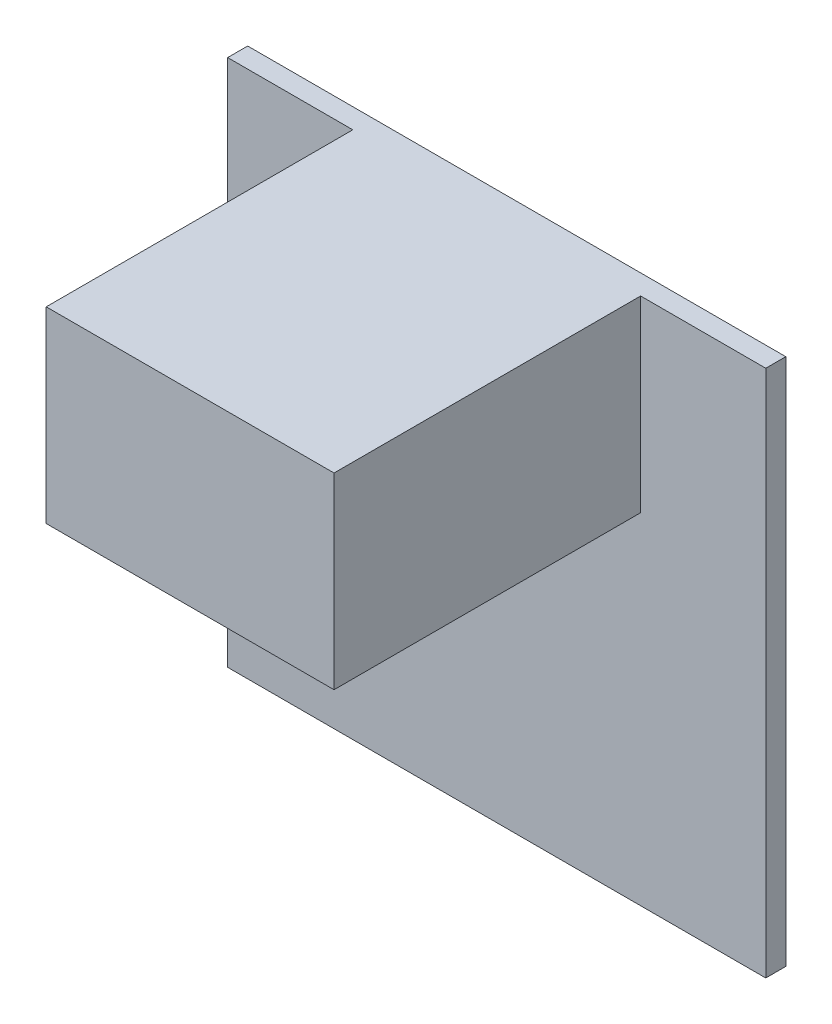
ISO-10303-21;
HEADER;
FILE_DESCRIPTION(('STEP AP214'),'2;1');
FILE_NAME('part.step','',(''),(''),'','','');
FILE_SCHEMA(('AUTOMOTIVE_DESIGN { 1 0 10303 214 1 1 1 1 }'));
ENDSEC;
DATA;
#1=APPLICATION_CONTEXT('core data for automotive mechanical design processes');
#2=APPLICATION_PROTOCOL_DEFINITION('international standard','automotive_design',2000,#1);
#3=PRODUCT_CONTEXT('',#1,'mechanical');
#4=PRODUCT('Part','Part','',(#3));
#5=PRODUCT_RELATED_PRODUCT_CATEGORY('part','',(#4));
#6=PRODUCT_DEFINITION_FORMATION('','',#4);
#7=PRODUCT_DEFINITION_CONTEXT('part definition',#1,'design');
#8=PRODUCT_DEFINITION('design','',#6,#7);
#9=PRODUCT_DEFINITION_SHAPE('','',#8);
#10=(LENGTH_UNIT() NAMED_UNIT(*) SI_UNIT(.MILLI.,.METRE.));
#11=(NAMED_UNIT(*) PLANE_ANGLE_UNIT() SI_UNIT($,.RADIAN.));
#12=(NAMED_UNIT(*) SI_UNIT($,.STERADIAN.) SOLID_ANGLE_UNIT());
#13=UNCERTAINTY_MEASURE_WITH_UNIT(LENGTH_MEASURE(1.E-05),#10,'distance_accuracy_value','');
#14=(GEOMETRIC_REPRESENTATION_CONTEXT(3) GLOBAL_UNCERTAINTY_ASSIGNED_CONTEXT((#13)) GLOBAL_UNIT_ASSIGNED_CONTEXT((#10,
#11,#12)) REPRESENTATION_CONTEXT('',''));
#15=CARTESIAN_POINT('',(0.,0.,0.));
#16=DIRECTION('',(0.,0.,1.));
#17=DIRECTION('',(1.,0.,0.));
#18=AXIS2_PLACEMENT_3D('',#15,#16,#17);
#19=CARTESIAN_POINT('',(0.,0.,1.6));
#20=DIRECTION('',(0.,0.,-1.));
#21=DIRECTION('',(-1.,0.,0.));
#22=AXIS2_PLACEMENT_3D('',#19,#20,#21);
#23=PLANE('',#22);
#24=DIRECTION('',(0.,-1.,0.));
#25=VECTOR('',#24,1.);
#26=CARTESIAN_POINT('',(10.,42.2,1.6));
#27=LINE('',#26,#25);
#28=CARTESIAN_POINT('',(10.,42.2,1.6));
#29=VERTEX_POINT('',#28);
#30=CARTESIAN_POINT('',(10.,27.2,1.6));
#31=VERTEX_POINT('',#30);
#32=EDGE_CURVE('E123',#29,#31,#27,.T.);
#33=ORIENTED_EDGE('',*,*,#32,.F.);
#34=DIRECTION('',(-1.,0.,0.));
#35=VECTOR('',#34,1.);
#36=CARTESIAN_POINT('',(0.,42.2,1.6));
#37=LINE('',#36,#35);
#38=CARTESIAN_POINT('',(0.,42.2,1.6));
#39=VERTEX_POINT('',#38);
#40=EDGE_CURVE('E61',#29,#39,#37,.T.);
#41=ORIENTED_EDGE('',*,*,#40,.T.);
#42=DIRECTION('',(0.,-1.,0.));
#43=VECTOR('',#42,1.);
#44=CARTESIAN_POINT('',(0.,0.,1.6));
#45=LINE('',#44,#43);
#46=CARTESIAN_POINT('',(0.,0.,1.6));
#47=VERTEX_POINT('',#46);
#48=EDGE_CURVE('E148',#39,#47,#45,.T.);
#49=ORIENTED_EDGE('',*,*,#48,.T.);
#50=DIRECTION('',(1.,0.,0.));
#51=VECTOR('',#50,1.);
#52=CARTESIAN_POINT('',(0.,0.,1.6));
#53=LINE('',#52,#51);
#54=CARTESIAN_POINT('',(43.,0.,1.6));
#55=VERTEX_POINT('',#54);
#56=EDGE_CURVE('E90',#47,#55,#53,.T.);
#57=ORIENTED_EDGE('',*,*,#56,.T.);
#58=DIRECTION('',(0.,1.,0.));
#59=VECTOR('',#58,1.);
#60=CARTESIAN_POINT('',(43.,0.,1.6));
#61=LINE('',#60,#59);
#62=CARTESIAN_POINT('',(43.,42.2,1.6));
#63=VERTEX_POINT('',#62);
#64=EDGE_CURVE('E151',#55,#63,#61,.T.);
#65=ORIENTED_EDGE('',*,*,#64,.T.);
#66=CARTESIAN_POINT('',(33.,42.2,1.6));
#67=VERTEX_POINT('',#66);
#68=EDGE_CURVE('E153',#63,#67,#37,.T.);
#69=ORIENTED_EDGE('',*,*,#68,.T.);
#70=DIRECTION('',(0.,-1.,0.));
#71=VECTOR('',#70,1.);
#72=CARTESIAN_POINT('',(33.,42.2,1.6));
#73=LINE('',#72,#71);
#74=CARTESIAN_POINT('',(33.,27.2,1.6));
#75=VERTEX_POINT('',#74);
#76=EDGE_CURVE('E141',#67,#75,#73,.T.);
#77=ORIENTED_EDGE('',*,*,#76,.T.);
#78=DIRECTION('',(1.,0.,0.));
#79=VECTOR('',#78,1.);
#80=CARTESIAN_POINT('',(10.,27.2,1.6));
#81=LINE('',#80,#79);
#82=EDGE_CURVE('E52',#31,#75,#81,.T.);
#83=ORIENTED_EDGE('',*,*,#82,.F.);
#84=EDGE_LOOP('',(#33,#41,#49,#57,#65,#69,#77,#83));
#85=FACE_BOUND('',#84,.T.);
#86=ADVANCED_FACE('F37',(#85),#23,.F.);
#87=CARTESIAN_POINT('',(0.,0.,1.6));
#88=DIRECTION('',(1.,0.,0.));
#89=DIRECTION('',(0.,0.,-1.));
#90=AXIS2_PLACEMENT_3D('',#87,#88,#89);
#91=PLANE('',#90);
#92=DIRECTION('',(0.,-1.,0.));
#93=VECTOR('',#92,1.);
#94=CARTESIAN_POINT('',(0.,0.,0.));
#95=LINE('',#94,#93);
#96=CARTESIAN_POINT('',(0.,42.2,0.));
#97=VERTEX_POINT('',#96);
#98=CARTESIAN_POINT('',(0.,0.,0.));
#99=VERTEX_POINT('',#98);
#100=EDGE_CURVE('E130',#97,#99,#95,.T.);
#101=ORIENTED_EDGE('',*,*,#100,.T.);
#102=DIRECTION('',(0.,0.,-1.));
#103=VECTOR('',#102,1.);
#104=CARTESIAN_POINT('',(0.,0.,1.6));
#105=LINE('',#104,#103);
#106=EDGE_CURVE('E11',#47,#99,#105,.T.);
#107=ORIENTED_EDGE('',*,*,#106,.F.);
#108=ORIENTED_EDGE('',*,*,#48,.F.);
#109=DIRECTION('',(0.,0.,-1.));
#110=VECTOR('',#109,1.);
#111=CARTESIAN_POINT('',(0.,42.2,1.6));
#112=LINE('',#111,#110);
#113=EDGE_CURVE('E156',#39,#97,#112,.T.);
#114=ORIENTED_EDGE('',*,*,#113,.T.);
#115=EDGE_LOOP('',(#101,#107,#108,#114));
#116=FACE_BOUND('',#115,.T.);
#117=ADVANCED_FACE('F39',(#116),#91,.F.);
#118=CARTESIAN_POINT('',(0.,0.,1.6));
#119=DIRECTION('',(0.,1.,0.));
#120=DIRECTION('',(0.,0.,1.));
#121=AXIS2_PLACEMENT_3D('',#118,#119,#120);
#122=PLANE('',#121);
#123=DIRECTION('',(1.,0.,0.));
#124=VECTOR('',#123,1.);
#125=CARTESIAN_POINT('',(0.,0.,0.));
#126=LINE('',#125,#124);
#127=CARTESIAN_POINT('',(43.,0.,0.));
#128=VERTEX_POINT('',#127);
#129=EDGE_CURVE('E159',#99,#128,#126,.T.);
#130=ORIENTED_EDGE('',*,*,#129,.T.);
#131=DIRECTION('',(0.,0.,-1.));
#132=VECTOR('',#131,1.);
#133=CARTESIAN_POINT('',(43.,0.,1.6));
#134=LINE('',#133,#132);
#135=EDGE_CURVE('E45',#55,#128,#134,.T.);
#136=ORIENTED_EDGE('',*,*,#135,.F.);
#137=ORIENTED_EDGE('',*,*,#56,.F.);
#138=ORIENTED_EDGE('',*,*,#106,.T.);
#139=EDGE_LOOP('',(#130,#136,#137,#138));
#140=FACE_BOUND('',#139,.T.);
#141=ADVANCED_FACE('F187',(#140),#122,.F.);
#142=CARTESIAN_POINT('',(43.,0.,1.6));
#143=DIRECTION('',(-1.,0.,0.));
#144=DIRECTION('',(0.,0.,1.));
#145=AXIS2_PLACEMENT_3D('',#142,#143,#144);
#146=PLANE('',#145);
#147=DIRECTION('',(0.,1.,0.));
#148=VECTOR('',#147,1.);
#149=CARTESIAN_POINT('',(43.,0.,0.));
#150=LINE('',#149,#148);
#151=CARTESIAN_POINT('',(43.,42.2,0.));
#152=VERTEX_POINT('',#151);
#153=EDGE_CURVE('E161',#128,#152,#150,.T.);
#154=ORIENTED_EDGE('',*,*,#153,.T.);
#155=DIRECTION('',(0.,0.,-1.));
#156=VECTOR('',#155,1.);
#157=CARTESIAN_POINT('',(43.,42.2,1.6));
#158=LINE('',#157,#156);
#159=EDGE_CURVE('E165',#63,#152,#158,.T.);
#160=ORIENTED_EDGE('',*,*,#159,.F.);
#161=ORIENTED_EDGE('',*,*,#64,.F.);
#162=ORIENTED_EDGE('',*,*,#135,.T.);
#163=EDGE_LOOP('',(#154,#160,#161,#162));
#164=FACE_BOUND('',#163,.T.);
#165=ADVANCED_FACE('F170',(#164),#146,.F.);
#166=CARTESIAN_POINT('',(0.,42.2,1.6));
#167=DIRECTION('',(0.,-1.,0.));
#168=DIRECTION('',(0.,0.,-1.));
#169=AXIS2_PLACEMENT_3D('',#166,#167,#168);
#170=PLANE('',#169);
#171=DIRECTION('',(-1.,0.,0.));
#172=VECTOR('',#171,1.);
#173=CARTESIAN_POINT('',(0.,42.2,0.));
#174=LINE('',#173,#172);
#175=EDGE_CURVE('E83',#152,#97,#174,.T.);
#176=ORIENTED_EDGE('',*,*,#175,.T.);
#177=ORIENTED_EDGE('',*,*,#113,.F.);
#178=ORIENTED_EDGE('',*,*,#40,.F.);
#179=DIRECTION('',(0.,0.,-1.));
#180=VECTOR('',#179,1.);
#181=CARTESIAN_POINT('',(10.,42.2,26.1));
#182=LINE('',#181,#180);
#183=CARTESIAN_POINT('',(10.,42.2,26.1));
#184=VERTEX_POINT('',#183);
#185=EDGE_CURVE('E145',#184,#29,#182,.T.);
#186=ORIENTED_EDGE('',*,*,#185,.F.);
#187=DIRECTION('',(1.,0.,0.));
#188=VECTOR('',#187,1.);
#189=CARTESIAN_POINT('',(10.,42.2,26.1));
#190=LINE('',#189,#188);
#191=CARTESIAN_POINT('',(33.,42.2,26.1));
#192=VERTEX_POINT('',#191);
#193=EDGE_CURVE('E134',#184,#192,#190,.T.);
#194=ORIENTED_EDGE('',*,*,#193,.T.);
#195=DIRECTION('',(0.,0.,-1.));
#196=VECTOR('',#195,1.);
#197=CARTESIAN_POINT('',(33.,42.2,26.1));
#198=LINE('',#197,#196);
#199=EDGE_CURVE('E131',#192,#67,#198,.T.);
#200=ORIENTED_EDGE('',*,*,#199,.T.);
#201=ORIENTED_EDGE('',*,*,#68,.F.);
#202=ORIENTED_EDGE('',*,*,#159,.T.);
#203=EDGE_LOOP('',(#176,#177,#178,#186,#194,#200,#201,#202));
#204=FACE_BOUND('',#203,.T.);
#205=ADVANCED_FACE('F178',(#204),#170,.F.);
#206=CARTESIAN_POINT('',(0.,0.,0.));
#207=DIRECTION('',(0.,0.,-1.));
#208=DIRECTION('',(-1.,0.,0.));
#209=AXIS2_PLACEMENT_3D('',#206,#207,#208);
#210=PLANE('',#209);
#211=ORIENTED_EDGE('',*,*,#100,.F.);
#212=ORIENTED_EDGE('',*,*,#175,.F.);
#213=ORIENTED_EDGE('',*,*,#153,.F.);
#214=ORIENTED_EDGE('',*,*,#129,.F.);
#215=EDGE_LOOP('',(#211,#212,#213,#214));
#216=FACE_BOUND('',#215,.T.);
#217=ADVANCED_FACE('F174',(#216),#210,.T.);
#218=CARTESIAN_POINT('',(10.,27.2,26.1));
#219=DIRECTION('',(0.,1.,0.));
#220=DIRECTION('',(0.,0.,1.));
#221=AXIS2_PLACEMENT_3D('',#218,#219,#220);
#222=PLANE('',#221);
#223=ORIENTED_EDGE('',*,*,#82,.T.);
#224=DIRECTION('',(0.,0.,-1.));
#225=VECTOR('',#224,1.);
#226=CARTESIAN_POINT('',(33.,27.2,26.1));
#227=LINE('',#226,#225);
#228=CARTESIAN_POINT('',(33.,27.2,26.1));
#229=VERTEX_POINT('',#228);
#230=EDGE_CURVE('E125',#229,#75,#227,.T.);
#231=ORIENTED_EDGE('',*,*,#230,.F.);
#232=DIRECTION('',(1.,0.,0.));
#233=VECTOR('',#232,1.);
#234=CARTESIAN_POINT('',(10.,27.2,26.1));
#235=LINE('',#234,#233);
#236=CARTESIAN_POINT('',(10.,27.2,26.1));
#237=VERTEX_POINT('',#236);
#238=EDGE_CURVE('E114',#237,#229,#235,.T.);
#239=ORIENTED_EDGE('',*,*,#238,.F.);
#240=DIRECTION('',(0.,0.,-1.));
#241=VECTOR('',#240,1.);
#242=CARTESIAN_POINT('',(10.,27.2,26.1));
#243=LINE('',#242,#241);
#244=EDGE_CURVE('E139',#237,#31,#243,.T.);
#245=ORIENTED_EDGE('',*,*,#244,.T.);
#246=EDGE_LOOP('',(#223,#231,#239,#245));
#247=FACE_BOUND('',#246,.T.);
#248=ADVANCED_FACE('F126',(#247),#222,.F.);
#249=CARTESIAN_POINT('',(33.,42.2,26.1));
#250=DIRECTION('',(1.,0.,0.));
#251=DIRECTION('',(0.,0.,-1.));
#252=AXIS2_PLACEMENT_3D('',#249,#250,#251);
#253=PLANE('',#252);
#254=ORIENTED_EDGE('',*,*,#76,.F.);
#255=ORIENTED_EDGE('',*,*,#199,.F.);
#256=DIRECTION('',(0.,-1.,0.));
#257=VECTOR('',#256,1.);
#258=CARTESIAN_POINT('',(33.,42.2,26.1));
#259=LINE('',#258,#257);
#260=EDGE_CURVE('E118',#192,#229,#259,.T.);
#261=ORIENTED_EDGE('',*,*,#260,.T.);
#262=ORIENTED_EDGE('',*,*,#230,.T.);
#263=EDGE_LOOP('',(#254,#255,#261,#262));
#264=FACE_BOUND('',#263,.T.);
#265=ADVANCED_FACE('F133',(#264),#253,.T.);
#266=CARTESIAN_POINT('',(10.,42.2,26.1));
#267=DIRECTION('',(1.,0.,0.));
#268=DIRECTION('',(0.,1.,0.));
#269=AXIS2_PLACEMENT_3D('',#266,#267,#268);
#270=PLANE('',#269);
#271=ORIENTED_EDGE('',*,*,#32,.T.);
#272=ORIENTED_EDGE('',*,*,#244,.F.);
#273=DIRECTION('',(0.,-1.,0.));
#274=VECTOR('',#273,1.);
#275=CARTESIAN_POINT('',(10.,42.2,26.1));
#276=LINE('',#275,#274);
#277=EDGE_CURVE('E121',#184,#237,#276,.T.);
#278=ORIENTED_EDGE('',*,*,#277,.F.);
#279=ORIENTED_EDGE('',*,*,#185,.T.);
#280=EDGE_LOOP('',(#271,#272,#278,#279));
#281=FACE_BOUND('',#280,.T.);
#282=ADVANCED_FACE('F180',(#281),#270,.F.);
#283=CARTESIAN_POINT('',(0.,0.,26.1));
#284=DIRECTION('',(0.,0.,-1.));
#285=DIRECTION('',(-1.,0.,0.));
#286=AXIS2_PLACEMENT_3D('',#283,#284,#285);
#287=PLANE('',#286);
#288=ORIENTED_EDGE('',*,*,#238,.T.);
#289=ORIENTED_EDGE('',*,*,#260,.F.);
#290=ORIENTED_EDGE('',*,*,#193,.F.);
#291=ORIENTED_EDGE('',*,*,#277,.T.);
#292=EDGE_LOOP('',(#288,#289,#290,#291));
#293=FACE_BOUND('',#292,.T.);
#294=ADVANCED_FACE('F115',(#293),#287,.F.);
#295=CLOSED_SHELL('',(#86,#117,#141,#165,#205,#217,#248,#265,#282,#294));
#296=MANIFOLD_SOLID_BREP('B2',#295);
#297=ADVANCED_BREP_SHAPE_REPRESENTATION('',(#18,#296),#14);
#298=SHAPE_DEFINITION_REPRESENTATION(#9,#297);
ENDSEC;
END-ISO-10303-21;
